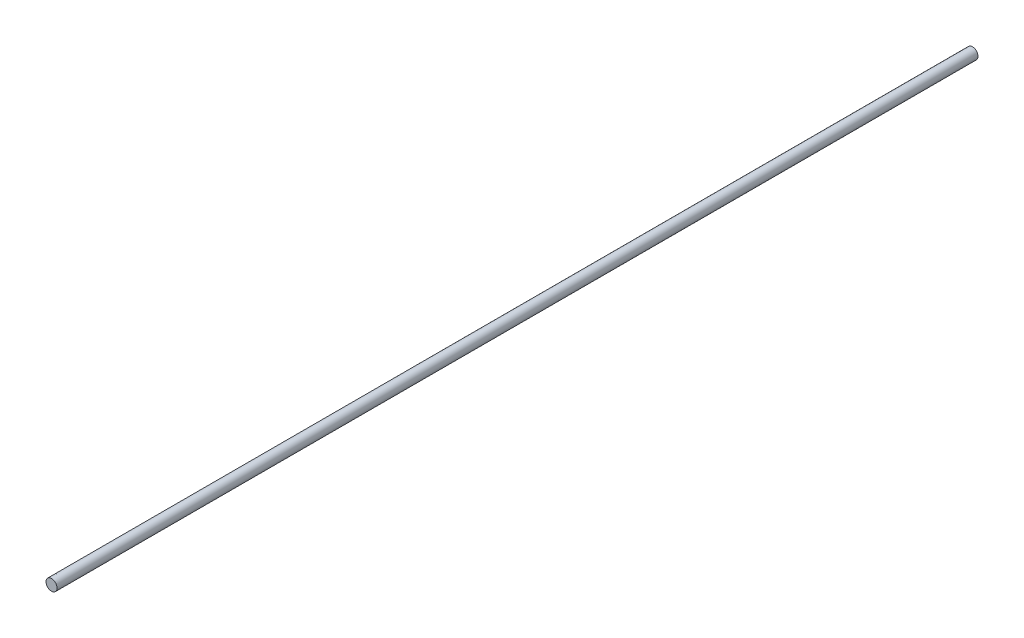
ISO-10303-21;
HEADER;
FILE_DESCRIPTION(('STEP AP214'),'2;1');
FILE_NAME('part.step','',(''),(''),'','','');
FILE_SCHEMA(('AUTOMOTIVE_DESIGN { 1 0 10303 214 1 1 1 1 }'));
ENDSEC;
DATA;
#1=APPLICATION_CONTEXT('core data for automotive mechanical design processes');
#2=APPLICATION_PROTOCOL_DEFINITION('international standard','automotive_design',2000,#1);
#3=PRODUCT_CONTEXT('',#1,'mechanical');
#4=PRODUCT('Part','Part','',(#3));
#5=PRODUCT_RELATED_PRODUCT_CATEGORY('part','',(#4));
#6=PRODUCT_DEFINITION_FORMATION('','',#4);
#7=PRODUCT_DEFINITION_CONTEXT('part definition',#1,'design');
#8=PRODUCT_DEFINITION('design','',#6,#7);
#9=PRODUCT_DEFINITION_SHAPE('','',#8);
#10=(LENGTH_UNIT() NAMED_UNIT(*) SI_UNIT(.MILLI.,.METRE.));
#11=(NAMED_UNIT(*) PLANE_ANGLE_UNIT() SI_UNIT($,.RADIAN.));
#12=(NAMED_UNIT(*) SI_UNIT($,.STERADIAN.) SOLID_ANGLE_UNIT());
#13=UNCERTAINTY_MEASURE_WITH_UNIT(LENGTH_MEASURE(1.E-05),#10,'distance_accuracy_value','');
#14=(GEOMETRIC_REPRESENTATION_CONTEXT(3) GLOBAL_UNCERTAINTY_ASSIGNED_CONTEXT((#13)) GLOBAL_UNIT_ASSIGNED_CONTEXT((#10,
#11,#12)) REPRESENTATION_CONTEXT('',''));
#15=CARTESIAN_POINT('',(0.,0.,0.));
#16=DIRECTION('',(0.,0.,1.));
#17=DIRECTION('',(1.,0.,0.));
#18=AXIS2_PLACEMENT_3D('',#15,#16,#17);
#19=CARTESIAN_POINT('',(0.,0.,250.));
#20=DIRECTION('',(0.,0.,-1.));
#21=DIRECTION('',(-1.,0.,0.));
#22=AXIS2_PLACEMENT_3D('',#19,#20,#21);
#23=CYLINDRICAL_SURFACE('',#22,3.);
#24=CARTESIAN_POINT('',(0.,0.,250.));
#25=DIRECTION('',(0.,0.,1.));
#26=DIRECTION('',(1.,0.,0.));
#27=AXIS2_PLACEMENT_3D('',#24,#25,#26);
#28=CIRCLE('',#27,3.);
#29=CARTESIAN_POINT('',(3.,0.,250.));
#30=VERTEX_POINT('',#29);
#31=EDGE_CURVE('E10',#30,#30,#28,.T.);
#32=ORIENTED_EDGE('',*,*,#31,.F.);
#33=EDGE_LOOP('',(#32));
#34=FACE_BOUND('',#33,.T.);
#35=CARTESIAN_POINT('',(0.,0.,-250.));
#36=DIRECTION('',(0.,0.,1.));
#37=DIRECTION('',(1.,0.,0.));
#38=AXIS2_PLACEMENT_3D('',#35,#36,#37);
#39=CIRCLE('',#38,3.);
#40=CARTESIAN_POINT('',(3.,0.,-250.));
#41=VERTEX_POINT('',#40);
#42=EDGE_CURVE('E40',#41,#41,#39,.T.);
#43=ORIENTED_EDGE('',*,*,#42,.T.);
#44=EDGE_LOOP('',(#43));
#45=FACE_BOUND('',#44,.T.);
#46=ADVANCED_FACE('F37',(#34,#45),#23,.T.);
#47=CARTESIAN_POINT('',(0.,0.,250.));
#48=DIRECTION('',(0.,0.,1.));
#49=DIRECTION('',(1.,0.,0.));
#50=AXIS2_PLACEMENT_3D('',#47,#48,#49);
#51=PLANE('',#50);
#52=ORIENTED_EDGE('',*,*,#31,.T.);
#53=EDGE_LOOP('',(#52));
#54=FACE_BOUND('',#53,.T.);
#55=ADVANCED_FACE('F54',(#54),#51,.T.);
#56=CARTESIAN_POINT('',(0.,0.,-250.));
#57=DIRECTION('',(0.,0.,1.));
#58=DIRECTION('',(1.,0.,0.));
#59=AXIS2_PLACEMENT_3D('',#56,#57,#58);
#60=PLANE('',#59);
#61=ORIENTED_EDGE('',*,*,#42,.F.);
#62=EDGE_LOOP('',(#61));
#63=FACE_BOUND('',#62,.T.);
#64=ADVANCED_FACE('F52',(#63),#60,.F.);
#65=CLOSED_SHELL('',(#46,#55,#64));
#66=MANIFOLD_SOLID_BREP('B2',#65);
#67=ADVANCED_BREP_SHAPE_REPRESENTATION('',(#18,#66),#14);
#68=SHAPE_DEFINITION_REPRESENTATION(#9,#67);
ENDSEC;
END-ISO-10303-21;
